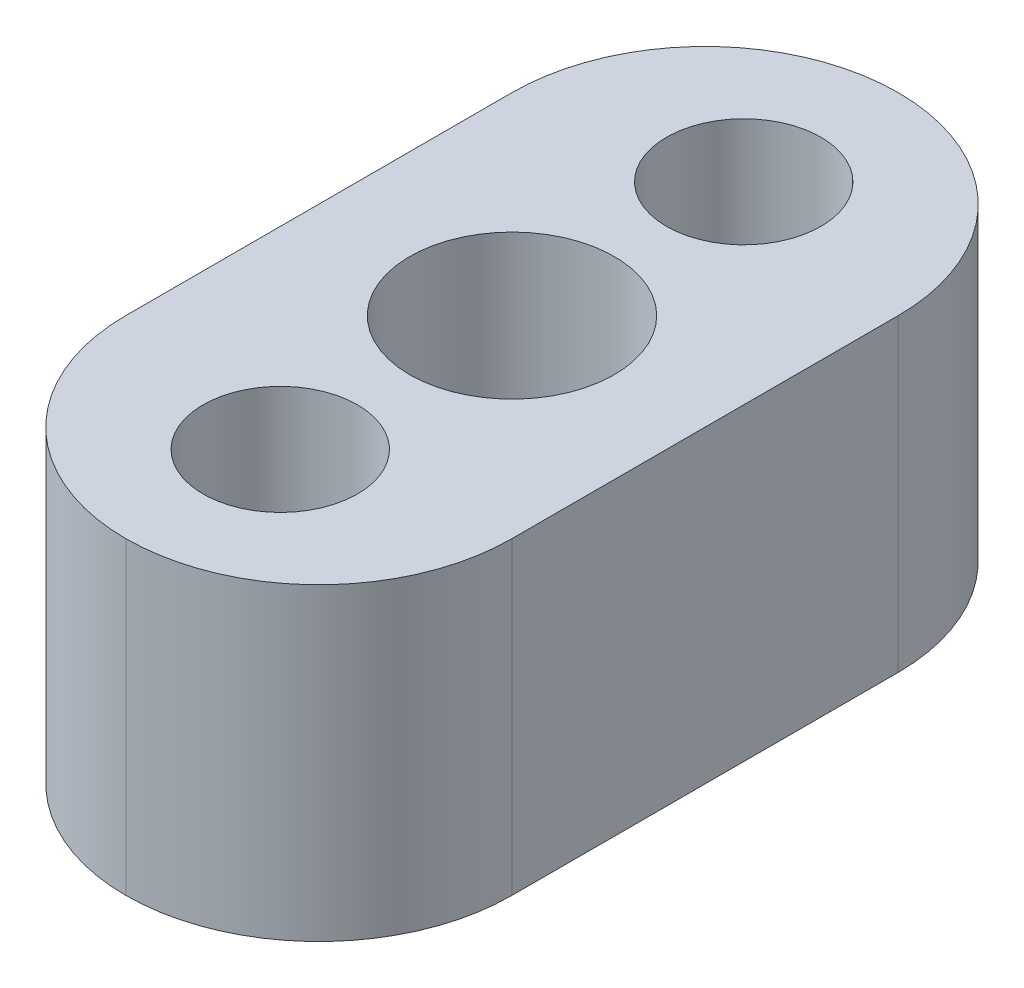
ISO-10303-21;
HEADER;
FILE_DESCRIPTION(('STEP AP214'),'2;1');
FILE_NAME('part.step','',(''),(''),'','','');
FILE_SCHEMA(('AUTOMOTIVE_DESIGN { 1 0 10303 214 1 1 1 1 }'));
ENDSEC;
DATA;
#1=APPLICATION_CONTEXT('core data for automotive mechanical design processes');
#2=APPLICATION_PROTOCOL_DEFINITION('international standard','automotive_design',2000,#1);
#3=PRODUCT_CONTEXT('',#1,'mechanical');
#4=PRODUCT('Part','Part','',(#3));
#5=PRODUCT_RELATED_PRODUCT_CATEGORY('part','',(#4));
#6=PRODUCT_DEFINITION_FORMATION('','',#4);
#7=PRODUCT_DEFINITION_CONTEXT('part definition',#1,'design');
#8=PRODUCT_DEFINITION('design','',#6,#7);
#9=PRODUCT_DEFINITION_SHAPE('','',#8);
#10=(LENGTH_UNIT() NAMED_UNIT(*) SI_UNIT(.MILLI.,.METRE.));
#11=(NAMED_UNIT(*) PLANE_ANGLE_UNIT() SI_UNIT($,.RADIAN.));
#12=(NAMED_UNIT(*) SI_UNIT($,.STERADIAN.) SOLID_ANGLE_UNIT());
#13=UNCERTAINTY_MEASURE_WITH_UNIT(LENGTH_MEASURE(1.E-05),#10,'distance_accuracy_value','');
#14=(GEOMETRIC_REPRESENTATION_CONTEXT(3) GLOBAL_UNCERTAINTY_ASSIGNED_CONTEXT((#13)) GLOBAL_UNIT_ASSIGNED_CONTEXT((#10,
#11,#12)) REPRESENTATION_CONTEXT('',''));
#15=CARTESIAN_POINT('',(0.,0.,0.));
#16=DIRECTION('',(0.,0.,1.));
#17=DIRECTION('',(1.,0.,0.));
#18=AXIS2_PLACEMENT_3D('',#15,#16,#17);
#19=CARTESIAN_POINT('',(0.,8.,0.));
#20=DIRECTION('',(0.,-1.,0.));
#21=DIRECTION('',(0.,0.,-1.));
#22=AXIS2_PLACEMENT_3D('',#19,#20,#21);
#23=PLANE('',#22);
#24=CARTESIAN_POINT('',(5.,8.,-10.));
#25=DIRECTION('',(0.,1.,0.));
#26=DIRECTION('',(0.,0.,1.));
#27=AXIS2_PLACEMENT_3D('',#24,#25,#26);
#28=CIRCLE('',#27,2.65);
#29=CARTESIAN_POINT('',(5.,8.,-7.35));
#30=VERTEX_POINT('',#29);
#31=EDGE_CURVE('E142',#30,#30,#28,.T.);
#32=ORIENTED_EDGE('',*,*,#31,.F.);
#33=EDGE_LOOP('',(#32));
#34=FACE_BOUND('',#33,.T.);
#35=DIRECTION('',(0.,0.,1.));
#36=VECTOR('',#35,1.);
#37=CARTESIAN_POINT('',(0.,8.,0.));
#38=LINE('',#37,#36);
#39=CARTESIAN_POINT('',(0.,8.,-15.));
#40=VERTEX_POINT('',#39);
#41=CARTESIAN_POINT('',(0.,8.,-5.));
#42=VERTEX_POINT('',#41);
#43=EDGE_CURVE('E111',#40,#42,#38,.T.);
#44=ORIENTED_EDGE('',*,*,#43,.T.);
#45=CARTESIAN_POINT('',(5.,8.,-5.));
#46=DIRECTION('',(0.,-1.,0.));
#47=DIRECTION('',(0.,0.,-1.));
#48=AXIS2_PLACEMENT_3D('',#45,#46,#47);
#49=CIRCLE('',#48,5.);
#50=CARTESIAN_POINT('',(5.,8.,0.));
#51=VERTEX_POINT('',#50);
#52=EDGE_CURVE('E138',#42,#51,#49,.F.);
#53=ORIENTED_EDGE('',*,*,#52,.T.);
#54=CARTESIAN_POINT('',(5.,8.,-5.));
#55=DIRECTION('',(0.,-1.,0.));
#56=DIRECTION('',(0.,0.,-1.));
#57=AXIS2_PLACEMENT_3D('',#54,#55,#56);
#58=CIRCLE('',#57,5.);
#59=CARTESIAN_POINT('',(10.,8.,-5.));
#60=VERTEX_POINT('',#59);
#61=EDGE_CURVE('E136',#51,#60,#58,.F.);
#62=ORIENTED_EDGE('',*,*,#61,.T.);
#63=DIRECTION('',(0.,0.,-1.));
#64=VECTOR('',#63,1.);
#65=CARTESIAN_POINT('',(10.,8.,0.));
#66=LINE('',#65,#64);
#67=CARTESIAN_POINT('',(10.,8.,-15.));
#68=VERTEX_POINT('',#67);
#69=EDGE_CURVE('E126',#60,#68,#66,.T.);
#70=ORIENTED_EDGE('',*,*,#69,.T.);
#71=CARTESIAN_POINT('',(5.,8.,-15.));
#72=DIRECTION('',(0.,-1.,0.));
#73=DIRECTION('',(0.,0.,-1.));
#74=AXIS2_PLACEMENT_3D('',#71,#72,#73);
#75=CIRCLE('',#74,5.);
#76=CARTESIAN_POINT('',(5.,8.,-20.));
#77=VERTEX_POINT('',#76);
#78=EDGE_CURVE('E54',#68,#77,#75,.F.);
#79=ORIENTED_EDGE('',*,*,#78,.T.);
#80=CARTESIAN_POINT('',(5.,8.,-15.));
#81=DIRECTION('',(0.,-1.,0.));
#82=DIRECTION('',(0.,0.,-1.));
#83=AXIS2_PLACEMENT_3D('',#80,#81,#82);
#84=CIRCLE('',#83,5.);
#85=EDGE_CURVE('E134',#77,#40,#84,.F.);
#86=ORIENTED_EDGE('',*,*,#85,.T.);
#87=EDGE_LOOP('',(#44,#53,#62,#70,#79,#86));
#88=FACE_BOUND('',#87,.T.);
#89=CARTESIAN_POINT('',(5.,8.,-16.));
#90=DIRECTION('',(0.,1.,0.));
#91=DIRECTION('',(0.,0.,1.));
#92=AXIS2_PLACEMENT_3D('',#89,#90,#91);
#93=CIRCLE('',#92,2.);
#94=CARTESIAN_POINT('',(5.,8.,-14.));
#95=VERTEX_POINT('',#94);
#96=EDGE_CURVE('E119',#95,#95,#93,.T.);
#97=ORIENTED_EDGE('',*,*,#96,.F.);
#98=EDGE_LOOP('',(#97));
#99=FACE_BOUND('',#98,.T.);
#100=CARTESIAN_POINT('',(5.,8.,-4.));
#101=DIRECTION('',(0.,1.,0.));
#102=DIRECTION('',(0.,0.,-1.));
#103=AXIS2_PLACEMENT_3D('',#100,#101,#102);
#104=CIRCLE('',#103,2.);
#105=CARTESIAN_POINT('',(5.,8.,-6.));
#106=VERTEX_POINT('',#105);
#107=EDGE_CURVE('E154',#106,#106,#104,.T.);
#108=ORIENTED_EDGE('',*,*,#107,.F.);
#109=EDGE_LOOP('',(#108));
#110=FACE_BOUND('',#109,.T.);
#111=ADVANCED_FACE('F37',(#34,#88,#99,#110),#23,.F.);
#112=CARTESIAN_POINT('',(0.,0.,0.));
#113=DIRECTION('',(0.,-1.,0.));
#114=DIRECTION('',(0.,0.,-1.));
#115=AXIS2_PLACEMENT_3D('',#112,#113,#114);
#116=PLANE('',#115);
#117=CARTESIAN_POINT('',(5.,0.,-16.));
#118=DIRECTION('',(0.,1.,0.));
#119=DIRECTION('',(0.,0.,1.));
#120=AXIS2_PLACEMENT_3D('',#117,#118,#119);
#121=CIRCLE('',#120,2.);
#122=CARTESIAN_POINT('',(5.,0.,-14.));
#123=VERTEX_POINT('',#122);
#124=EDGE_CURVE('E123',#123,#123,#121,.T.);
#125=ORIENTED_EDGE('',*,*,#124,.T.);
#126=EDGE_LOOP('',(#125));
#127=FACE_BOUND('',#126,.T.);
#128=CARTESIAN_POINT('',(5.,0.,-5.));
#129=DIRECTION('',(0.,-1.,0.));
#130=DIRECTION('',(0.,0.,-1.));
#131=AXIS2_PLACEMENT_3D('',#128,#129,#130);
#132=CIRCLE('',#131,5.);
#133=CARTESIAN_POINT('',(10.,0.,-5.));
#134=VERTEX_POINT('',#133);
#135=CARTESIAN_POINT('',(5.,0.,0.));
#136=VERTEX_POINT('',#135);
#137=EDGE_CURVE('E100',#134,#136,#132,.T.);
#138=ORIENTED_EDGE('',*,*,#137,.T.);
#139=CARTESIAN_POINT('',(5.,0.,-5.));
#140=DIRECTION('',(0.,-1.,0.));
#141=DIRECTION('',(0.,0.,-1.));
#142=AXIS2_PLACEMENT_3D('',#139,#140,#141);
#143=CIRCLE('',#142,5.);
#144=CARTESIAN_POINT('',(0.,0.,-5.));
#145=VERTEX_POINT('',#144);
#146=EDGE_CURVE('E113',#136,#145,#143,.T.);
#147=ORIENTED_EDGE('',*,*,#146,.T.);
#148=DIRECTION('',(0.,0.,1.));
#149=VECTOR('',#148,1.);
#150=CARTESIAN_POINT('',(0.,0.,0.));
#151=LINE('',#150,#149);
#152=CARTESIAN_POINT('',(0.,0.,-15.));
#153=VERTEX_POINT('',#152);
#154=EDGE_CURVE('E108',#153,#145,#151,.T.);
#155=ORIENTED_EDGE('',*,*,#154,.F.);
#156=CARTESIAN_POINT('',(5.,0.,-15.));
#157=DIRECTION('',(0.,-1.,0.));
#158=DIRECTION('',(0.,0.,-1.));
#159=AXIS2_PLACEMENT_3D('',#156,#157,#158);
#160=CIRCLE('',#159,5.);
#161=CARTESIAN_POINT('',(5.,0.,-20.));
#162=VERTEX_POINT('',#161);
#163=EDGE_CURVE('E92',#153,#162,#160,.T.);
#164=ORIENTED_EDGE('',*,*,#163,.T.);
#165=CARTESIAN_POINT('',(5.,0.,-15.));
#166=DIRECTION('',(0.,-1.,0.));
#167=DIRECTION('',(0.,0.,-1.));
#168=AXIS2_PLACEMENT_3D('',#165,#166,#167);
#169=CIRCLE('',#168,5.);
#170=CARTESIAN_POINT('',(10.,0.,-15.));
#171=VERTEX_POINT('',#170);
#172=EDGE_CURVE('E101',#162,#171,#169,.T.);
#173=ORIENTED_EDGE('',*,*,#172,.T.);
#174=DIRECTION('',(0.,0.,-1.));
#175=VECTOR('',#174,1.);
#176=CARTESIAN_POINT('',(10.,0.,0.));
#177=LINE('',#176,#175);
#178=EDGE_CURVE('E118',#134,#171,#177,.T.);
#179=ORIENTED_EDGE('',*,*,#178,.F.);
#180=EDGE_LOOP('',(#138,#147,#155,#164,#173,#179));
#181=FACE_BOUND('',#180,.T.);
#182=CARTESIAN_POINT('',(5.,0.,-4.));
#183=DIRECTION('',(0.,1.,0.));
#184=DIRECTION('',(0.,0.,-1.));
#185=AXIS2_PLACEMENT_3D('',#182,#183,#184);
#186=CIRCLE('',#185,2.);
#187=CARTESIAN_POINT('',(5.,0.,-6.));
#188=VERTEX_POINT('',#187);
#189=EDGE_CURVE('E151',#188,#188,#186,.T.);
#190=ORIENTED_EDGE('',*,*,#189,.T.);
#191=EDGE_LOOP('',(#190));
#192=FACE_BOUND('',#191,.T.);
#193=ADVANCED_FACE('F115',(#127,#181,#192),#116,.T.);
#194=CARTESIAN_POINT('',(0.,8.,0.));
#195=DIRECTION('',(1.,0.,0.));
#196=DIRECTION('',(0.,0.,-1.));
#197=AXIS2_PLACEMENT_3D('',#194,#195,#196);
#198=PLANE('',#197);
#199=ORIENTED_EDGE('',*,*,#154,.T.);
#200=DIRECTION('',(0.,-1.,0.));
#201=VECTOR('',#200,1.);
#202=CARTESIAN_POINT('',(0.,8.,-5.));
#203=LINE('',#202,#201);
#204=EDGE_CURVE('E112',#145,#42,#203,.F.);
#205=ORIENTED_EDGE('',*,*,#204,.T.);
#206=ORIENTED_EDGE('',*,*,#43,.F.);
#207=DIRECTION('',(0.,-1.,0.));
#208=VECTOR('',#207,1.);
#209=CARTESIAN_POINT('',(0.,8.,-15.));
#210=LINE('',#209,#208);
#211=EDGE_CURVE('E96',#40,#153,#210,.T.);
#212=ORIENTED_EDGE('',*,*,#211,.T.);
#213=EDGE_LOOP('',(#199,#205,#206,#212));
#214=FACE_BOUND('',#213,.T.);
#215=ADVANCED_FACE('F106',(#214),#198,.F.);
#216=CARTESIAN_POINT('',(10.,8.,0.));
#217=DIRECTION('',(-1.,0.,0.));
#218=DIRECTION('',(0.,0.,1.));
#219=AXIS2_PLACEMENT_3D('',#216,#217,#218);
#220=PLANE('',#219);
#221=ORIENTED_EDGE('',*,*,#69,.F.);
#222=DIRECTION('',(0.,-1.,0.));
#223=VECTOR('',#222,1.);
#224=CARTESIAN_POINT('',(10.,8.,-5.));
#225=LINE('',#224,#223);
#226=EDGE_CURVE('E11',#60,#134,#225,.T.);
#227=ORIENTED_EDGE('',*,*,#226,.T.);
#228=ORIENTED_EDGE('',*,*,#178,.T.);
#229=DIRECTION('',(0.,-1.,0.));
#230=VECTOR('',#229,1.);
#231=CARTESIAN_POINT('',(10.,8.,-15.));
#232=LINE('',#231,#230);
#233=EDGE_CURVE('E46',#171,#68,#232,.F.);
#234=ORIENTED_EDGE('',*,*,#233,.T.);
#235=EDGE_LOOP('',(#221,#227,#228,#234));
#236=FACE_BOUND('',#235,.T.);
#237=ADVANCED_FACE('F166',(#236),#220,.F.);
#238=CARTESIAN_POINT('',(5.,8.,-16.));
#239=DIRECTION('',(0.,-1.,0.));
#240=DIRECTION('',(0.,0.,-1.));
#241=AXIS2_PLACEMENT_3D('',#238,#239,#240);
#242=CYLINDRICAL_SURFACE('',#241,2.);
#243=ORIENTED_EDGE('',*,*,#96,.T.);
#244=EDGE_LOOP('',(#243));
#245=FACE_BOUND('',#244,.T.);
#246=ORIENTED_EDGE('',*,*,#124,.F.);
#247=EDGE_LOOP('',(#246));
#248=FACE_BOUND('',#247,.T.);
#249=ADVANCED_FACE('F188',(#245,#248),#242,.F.);
#250=CARTESIAN_POINT('',(5.,8.,-4.));
#251=DIRECTION('',(0.,-1.,0.));
#252=DIRECTION('',(0.,0.,-1.));
#253=AXIS2_PLACEMENT_3D('',#250,#251,#252);
#254=CYLINDRICAL_SURFACE('',#253,2.);
#255=ORIENTED_EDGE('',*,*,#107,.T.);
#256=EDGE_LOOP('',(#255));
#257=FACE_BOUND('',#256,.T.);
#258=ORIENTED_EDGE('',*,*,#189,.F.);
#259=EDGE_LOOP('',(#258));
#260=FACE_BOUND('',#259,.T.);
#261=ADVANCED_FACE('F208',(#257,#260),#254,.F.);
#262=CARTESIAN_POINT('',(5.,3.,-10.));
#263=DIRECTION('',(0.,1.,0.));
#264=DIRECTION('',(0.,0.,1.));
#265=AXIS2_PLACEMENT_3D('',#262,#263,#264);
#266=CYLINDRICAL_SURFACE('',#265,2.65);
#267=CARTESIAN_POINT('',(5.,3.,-10.));
#268=DIRECTION('',(0.,1.,0.));
#269=DIRECTION('',(0.,0.,1.));
#270=AXIS2_PLACEMENT_3D('',#267,#268,#269);
#271=CIRCLE('',#270,2.65);
#272=CARTESIAN_POINT('',(5.,3.,-7.35));
#273=VERTEX_POINT('',#272);
#274=EDGE_CURVE('E146',#273,#273,#271,.T.);
#275=ORIENTED_EDGE('',*,*,#274,.F.);
#276=EDGE_LOOP('',(#275));
#277=FACE_BOUND('',#276,.T.);
#278=ORIENTED_EDGE('',*,*,#31,.T.);
#279=EDGE_LOOP('',(#278));
#280=FACE_BOUND('',#279,.T.);
#281=ADVANCED_FACE('F215',(#277,#280),#266,.F.);
#282=CARTESIAN_POINT('',(5.,3.,-10.));
#283=DIRECTION('',(0.,1.,0.));
#284=DIRECTION('',(0.,0.,1.));
#285=AXIS2_PLACEMENT_3D('',#282,#283,#284);
#286=PLANE('',#285);
#287=ORIENTED_EDGE('',*,*,#274,.T.);
#288=EDGE_LOOP('',(#287));
#289=FACE_BOUND('',#288,.T.);
#290=ADVANCED_FACE('F176',(#289),#286,.T.);
#291=CARTESIAN_POINT('',(5.,8.,-5.));
#292=DIRECTION('',(0.,-1.,0.));
#293=DIRECTION('',(0.,0.,-1.));
#294=AXIS2_PLACEMENT_3D('',#291,#292,#293);
#295=CYLINDRICAL_SURFACE('',#294,5.);
#296=ORIENTED_EDGE('',*,*,#226,.F.);
#297=ORIENTED_EDGE('',*,*,#61,.F.);
#298=DIRECTION('',(0.,-1.,0.));
#299=VECTOR('',#298,1.);
#300=CARTESIAN_POINT('',(5.,8.,0.));
#301=LINE('',#300,#299);
#302=EDGE_CURVE('E140',#136,#51,#301,.F.);
#303=ORIENTED_EDGE('',*,*,#302,.F.);
#304=ORIENTED_EDGE('',*,*,#137,.F.);
#305=EDGE_LOOP('',(#296,#297,#303,#304));
#306=FACE_BOUND('',#305,.T.);
#307=ADVANCED_FACE('F168',(#306),#295,.T.);
#308=CARTESIAN_POINT('',(5.,8.,-5.));
#309=DIRECTION('',(0.,-1.,0.));
#310=DIRECTION('',(0.,0.,-1.));
#311=AXIS2_PLACEMENT_3D('',#308,#309,#310);
#312=CYLINDRICAL_SURFACE('',#311,5.);
#313=ORIENTED_EDGE('',*,*,#52,.F.);
#314=ORIENTED_EDGE('',*,*,#204,.F.);
#315=ORIENTED_EDGE('',*,*,#146,.F.);
#316=ORIENTED_EDGE('',*,*,#302,.T.);
#317=EDGE_LOOP('',(#313,#314,#315,#316));
#318=FACE_BOUND('',#317,.T.);
#319=ADVANCED_FACE('F169',(#318),#312,.T.);
#320=CARTESIAN_POINT('',(5.,8.,-15.));
#321=DIRECTION('',(0.,-1.,0.));
#322=DIRECTION('',(0.,0.,-1.));
#323=AXIS2_PLACEMENT_3D('',#320,#321,#322);
#324=CYLINDRICAL_SURFACE('',#323,5.);
#325=DIRECTION('',(0.,-1.,0.));
#326=VECTOR('',#325,1.);
#327=CARTESIAN_POINT('',(5.,8.,-20.));
#328=LINE('',#327,#326);
#329=EDGE_CURVE('E41',#77,#162,#328,.T.);
#330=ORIENTED_EDGE('',*,*,#329,.F.);
#331=ORIENTED_EDGE('',*,*,#78,.F.);
#332=ORIENTED_EDGE('',*,*,#233,.F.);
#333=ORIENTED_EDGE('',*,*,#172,.F.);
#334=EDGE_LOOP('',(#330,#331,#332,#333));
#335=FACE_BOUND('',#334,.T.);
#336=ADVANCED_FACE('F39',(#335),#324,.T.);
#337=CARTESIAN_POINT('',(5.,8.,-15.));
#338=DIRECTION('',(0.,-1.,0.));
#339=DIRECTION('',(0.,0.,-1.));
#340=AXIS2_PLACEMENT_3D('',#337,#338,#339);
#341=CYLINDRICAL_SURFACE('',#340,5.);
#342=ORIENTED_EDGE('',*,*,#85,.F.);
#343=ORIENTED_EDGE('',*,*,#329,.T.);
#344=ORIENTED_EDGE('',*,*,#163,.F.);
#345=ORIENTED_EDGE('',*,*,#211,.F.);
#346=EDGE_LOOP('',(#342,#343,#344,#345));
#347=FACE_BOUND('',#346,.T.);
#348=ADVANCED_FACE('F95',(#347),#341,.T.);
#349=CLOSED_SHELL('',(#111,#193,#215,#237,#249,#261,#281,#290,#307,#319,#336,#348));
#350=MANIFOLD_SOLID_BREP('B2',#349);
#351=ADVANCED_BREP_SHAPE_REPRESENTATION('',(#18,#350),#14);
#352=SHAPE_DEFINITION_REPRESENTATION(#9,#351);
ENDSEC;
END-ISO-10303-21;
